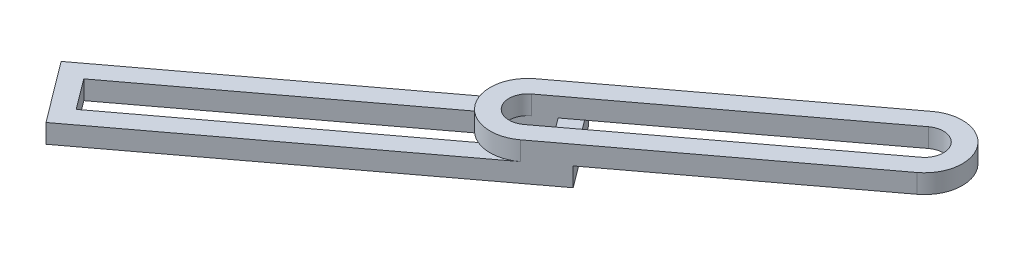
ISO-10303-21;
HEADER;
FILE_DESCRIPTION(('STEP AP214'),'2;1');
FILE_NAME('part.step','',(''),(''),'','','');
FILE_SCHEMA(('AUTOMOTIVE_DESIGN { 1 0 10303 214 1 1 1 1 }'));
ENDSEC;
DATA;
#1=APPLICATION_CONTEXT('core data for automotive mechanical design processes');
#2=APPLICATION_PROTOCOL_DEFINITION('international standard','automotive_design',2000,#1);
#3=PRODUCT_CONTEXT('',#1,'mechanical');
#4=PRODUCT('Part','Part','',(#3));
#5=PRODUCT_RELATED_PRODUCT_CATEGORY('part','',(#4));
#6=PRODUCT_DEFINITION_FORMATION('','',#4);
#7=PRODUCT_DEFINITION_CONTEXT('part definition',#1,'design');
#8=PRODUCT_DEFINITION('design','',#6,#7);
#9=PRODUCT_DEFINITION_SHAPE('','',#8);
#10=(LENGTH_UNIT() NAMED_UNIT(*) SI_UNIT(.MILLI.,.METRE.));
#11=(NAMED_UNIT(*) PLANE_ANGLE_UNIT() SI_UNIT($,.RADIAN.));
#12=(NAMED_UNIT(*) SI_UNIT($,.STERADIAN.) SOLID_ANGLE_UNIT());
#13=UNCERTAINTY_MEASURE_WITH_UNIT(LENGTH_MEASURE(1.E-05),#10,'distance_accuracy_value','');
#14=(GEOMETRIC_REPRESENTATION_CONTEXT(3) GLOBAL_UNCERTAINTY_ASSIGNED_CONTEXT((#13)) GLOBAL_UNIT_ASSIGNED_CONTEXT((#10,
#11,#12)) REPRESENTATION_CONTEXT('',''));
#15=CARTESIAN_POINT('',(0.,0.,0.));
#16=DIRECTION('',(0.,0.,1.));
#17=DIRECTION('',(1.,0.,0.));
#18=AXIS2_PLACEMENT_3D('',#15,#16,#17);
#19=CARTESIAN_POINT('',(0.,-2.,0.));
#20=DIRECTION('',(0.,1.,0.));
#21=DIRECTION('',(0.,0.,1.));
#22=AXIS2_PLACEMENT_3D('',#19,#20,#21);
#23=PLANE('',#22);
#24=DIRECTION('',(-0.8,0.,0.6));
#25=VECTOR('',#24,1.);
#26=CARTESIAN_POINT('',(21.1244876172001,-2.,28.1659834896001));
#27=LINE('',#26,#25);
#28=CARTESIAN_POINT('',(72.9212085995397,-2.,-10.6815572471546));
#29=VERTEX_POINT('',#28);
#30=CARTESIAN_POINT('',(71.3212085995398,-2.,-9.48155724715466));
#31=VERTEX_POINT('',#30);
#32=EDGE_CURVE('E11',#29,#31,#27,.T.);
#33=ORIENTED_EDGE('',*,*,#32,.F.);
#34=DIRECTION('',(0.6,0.,0.8));
#35=VECTOR('',#34,1.);
#36=CARTESIAN_POINT('',(51.7967209823397,-2.,-38.8475407367547));
#37=LINE('',#36,#35);
#38=CARTESIAN_POINT('',(70.5212085995397,-2.,-13.8815572471547));
#39=VERTEX_POINT('',#38);
#40=EDGE_CURVE('E245',#39,#29,#37,.T.);
#41=ORIENTED_EDGE('',*,*,#40,.F.);
#42=DIRECTION('',(-0.8,0.,0.6));
#43=VECTOR('',#42,1.);
#44=CARTESIAN_POINT('',(18.7244876172001,-2.,24.9659834896001));
#45=LINE('',#44,#43);
#46=CARTESIAN_POINT('',(68.9212085995398,-2.,-12.6815572471547));
#47=VERTEX_POINT('',#46);
#48=EDGE_CURVE('E44',#39,#47,#45,.T.);
#49=ORIENTED_EDGE('',*,*,#48,.T.);
#50=DIRECTION('',(0.6,0.,0.8));
#51=VECTOR('',#50,1.);
#52=CARTESIAN_POINT('',(50.1967209823397,-2.,-37.6475407367548));
#53=LINE('',#52,#51);
#54=EDGE_CURVE('E251',#47,#31,#53,.T.);
#55=ORIENTED_EDGE('',*,*,#54,.T.);
#56=EDGE_LOOP('',(#33,#41,#49,#55));
#57=FACE_BOUND('',#56,.T.);
#58=ADVANCED_FACE('F35',(#57),#23,.T.);
#59=CARTESIAN_POINT('',(50.1967209823397,-2.,-37.6475407367548));
#60=DIRECTION('',(0.8,0.,-0.6));
#61=DIRECTION('',(-0.6,0.,-0.8));
#62=AXIS2_PLACEMENT_3D('',#59,#60,#61);
#63=PLANE('',#62);
#64=DIRECTION('',(0.6,0.,0.8));
#65=VECTOR('',#64,1.);
#66=CARTESIAN_POINT('',(50.1967209823397,-4.,-37.6475407367548));
#67=LINE('',#66,#65);
#68=CARTESIAN_POINT('',(68.9212085995398,-4.,-12.6815572471547));
#69=VERTEX_POINT('',#68);
#70=CARTESIAN_POINT('',(71.3212085995398,-4.,-9.48155724715466));
#71=VERTEX_POINT('',#70);
#72=EDGE_CURVE('E271',#69,#71,#67,.T.);
#73=ORIENTED_EDGE('',*,*,#72,.T.);
#74=DIRECTION('',(0.,-1.,0.));
#75=VECTOR('',#74,1.);
#76=CARTESIAN_POINT('',(71.3212085995398,-2.,-9.48155724715466));
#77=LINE('',#76,#75);
#78=EDGE_CURVE('E288',#31,#71,#77,.T.);
#79=ORIENTED_EDGE('',*,*,#78,.F.);
#80=ORIENTED_EDGE('',*,*,#54,.F.);
#81=DIRECTION('',(0.,-1.,0.));
#82=VECTOR('',#81,1.);
#83=CARTESIAN_POINT('',(68.9212085995398,-2.,-12.6815572471547));
#84=LINE('',#83,#82);
#85=EDGE_CURVE('E282',#47,#69,#84,.T.);
#86=ORIENTED_EDGE('',*,*,#85,.T.);
#87=EDGE_LOOP('',(#73,#79,#80,#86));
#88=FACE_BOUND('',#87,.T.);
#89=ADVANCED_FACE('F331',(#88),#63,.F.);
#90=CARTESIAN_POINT('',(21.1244876172001,-2.,28.1659834896001));
#91=DIRECTION('',(-0.6,0.,-0.8));
#92=DIRECTION('',(-0.8,0.,0.6));
#93=AXIS2_PLACEMENT_3D('',#90,#91,#92);
#94=PLANE('',#93);
#95=DIRECTION('',(0.8,0.,-0.6));
#96=VECTOR('',#95,1.);
#97=CARTESIAN_POINT('',(21.1244876172001,-4.,28.1659834896001));
#98=LINE('',#97,#96);
#99=CARTESIAN_POINT('',(42.6212085995398,-4.,12.0434427528453));
#100=VERTEX_POINT('',#99);
#101=EDGE_CURVE('E274',#100,#71,#98,.T.);
#102=ORIENTED_EDGE('',*,*,#101,.F.);
#103=DIRECTION('',(0.,-1.,0.));
#104=VECTOR('',#103,1.);
#105=CARTESIAN_POINT('',(42.6212085995398,-2.,12.0434427528453));
#106=LINE('',#105,#104);
#107=CARTESIAN_POINT('',(42.6212085995398,-2.,12.0434427528453));
#108=VERTEX_POINT('',#107);
#109=EDGE_CURVE('E286',#108,#100,#106,.T.);
#110=ORIENTED_EDGE('',*,*,#109,.F.);
#111=DIRECTION('',(0.8,0.,-0.6));
#112=VECTOR('',#111,1.);
#113=CARTESIAN_POINT('',(21.1244876172001,-2.,28.1659834896001));
#114=LINE('',#113,#112);
#115=CARTESIAN_POINT('',(66.9499273074295,-2.,-6.203096278072));
#116=VERTEX_POINT('',#115);
#117=EDGE_CURVE('E253',#108,#116,#114,.T.);
#118=ORIENTED_EDGE('',*,*,#117,.T.);
#119=CARTESIAN_POINT('',(69.7212085995398,-2.,-8.28155724715468));
#120=VERTEX_POINT('',#119);
#121=EDGE_CURVE('E61',#116,#120,#114,.T.);
#122=ORIENTED_EDGE('',*,*,#121,.T.);
#123=DIRECTION('',(0.,-1.,0.));
#124=VECTOR('',#123,1.);
#125=CARTESIAN_POINT('',(69.7212085995398,0.,-8.28155724715468));
#126=LINE('',#125,#124);
#127=CARTESIAN_POINT('',(69.7212085995398,0.,-8.28155724715468));
#128=VERTEX_POINT('',#127);
#129=EDGE_CURVE('E168',#128,#120,#126,.T.);
#130=ORIENTED_EDGE('',*,*,#129,.F.);
#131=DIRECTION('',(-0.8,0.,0.6));
#132=VECTOR('',#131,1.);
#133=CARTESIAN_POINT('',(21.1244876172001,0.,28.1659834896001));
#134=LINE('',#133,#132);
#135=CARTESIAN_POINT('',(93.7212085995398,0.,-26.2815572471546));
#136=VERTEX_POINT('',#135);
#137=EDGE_CURVE('E175',#136,#128,#134,.T.);
#138=ORIENTED_EDGE('',*,*,#137,.F.);
#139=DIRECTION('',(0.,-1.,0.));
#140=VECTOR('',#139,1.);
#141=CARTESIAN_POINT('',(93.7212085995398,0.,-26.2815572471546));
#142=LINE('',#141,#140);
#143=CARTESIAN_POINT('',(93.7212085995398,-2.,-26.2815572471546));
#144=VERTEX_POINT('',#143);
#145=EDGE_CURVE('E198',#136,#144,#142,.T.);
#146=ORIENTED_EDGE('',*,*,#145,.T.);
#147=EDGE_CURVE('E46',#144,#29,#27,.T.);
#148=ORIENTED_EDGE('',*,*,#147,.T.);
#149=ORIENTED_EDGE('',*,*,#32,.T.);
#150=ORIENTED_EDGE('',*,*,#78,.T.);
#151=EDGE_LOOP('',(#102,#110,#118,#122,#130,#138,#146,#148,#149,#150));
#152=FACE_BOUND('',#151,.T.);
#153=ADVANCED_FACE('F179',(#152),#94,.T.);
#154=CARTESIAN_POINT('',(21.4967209823397,-2.,-16.1225407367548));
#155=DIRECTION('',(0.8,0.,-0.6));
#156=DIRECTION('',(-0.6,0.,-0.8));
#157=AXIS2_PLACEMENT_3D('',#154,#155,#156);
#158=PLANE('',#157);
#159=DIRECTION('',(0.6,0.,0.8));
#160=VECTOR('',#159,1.);
#161=CARTESIAN_POINT('',(21.4967209823397,-4.,-16.1225407367548));
#162=LINE('',#161,#160);
#163=CARTESIAN_POINT('',(40.2212085995398,-4.,8.84344275284533));
#164=VERTEX_POINT('',#163);
#165=EDGE_CURVE('E277',#164,#100,#162,.T.);
#166=ORIENTED_EDGE('',*,*,#165,.F.);
#167=DIRECTION('',(0.,-1.,0.));
#168=VECTOR('',#167,1.);
#169=CARTESIAN_POINT('',(40.2212085995398,-2.,8.84344275284533));
#170=LINE('',#169,#168);
#171=CARTESIAN_POINT('',(40.2212085995398,-2.,8.84344275284533));
#172=VERTEX_POINT('',#171);
#173=EDGE_CURVE('E284',#172,#164,#170,.T.);
#174=ORIENTED_EDGE('',*,*,#173,.F.);
#175=DIRECTION('',(0.6,0.,0.8));
#176=VECTOR('',#175,1.);
#177=CARTESIAN_POINT('',(21.4967209823397,-2.,-16.1225407367548));
#178=LINE('',#177,#176);
#179=EDGE_CURVE('E255',#172,#108,#178,.T.);
#180=ORIENTED_EDGE('',*,*,#179,.T.);
#181=ORIENTED_EDGE('',*,*,#109,.T.);
#182=EDGE_LOOP('',(#166,#174,#180,#181));
#183=FACE_BOUND('',#182,.T.);
#184=ADVANCED_FACE('F353',(#183),#158,.T.);
#185=CARTESIAN_POINT('',(22.3244876172001,-2.,29.7659834896001));
#186=DIRECTION('',(0.6,0.,0.8));
#187=DIRECTION('',(0.8,0.,-0.6));
#188=AXIS2_PLACEMENT_3D('',#185,#186,#187);
#189=PLANE('',#188);
#190=DIRECTION('',(-0.8,0.,0.6));
#191=VECTOR('',#190,1.);
#192=CARTESIAN_POINT('',(22.3244876172001,-4.,29.7659834896001));
#193=LINE('',#192,#191);
#194=CARTESIAN_POINT('',(74.1212085995397,-4.,-9.08155724715465));
#195=VERTEX_POINT('',#194);
#196=CARTESIAN_POINT('',(42.2212085995398,-4.,14.8434427528453));
#197=VERTEX_POINT('',#196);
#198=EDGE_CURVE('E236',#195,#197,#193,.T.);
#199=ORIENTED_EDGE('',*,*,#198,.F.);
#200=DIRECTION('',(0.,-1.,0.));
#201=VECTOR('',#200,1.);
#202=CARTESIAN_POINT('',(74.1212085995397,-2.,-9.08155724715465));
#203=LINE('',#202,#201);
#204=CARTESIAN_POINT('',(74.1212085995397,-2.,-9.08155724715465));
#205=VERTEX_POINT('',#204);
#206=EDGE_CURVE('E39',#205,#195,#203,.T.);
#207=ORIENTED_EDGE('',*,*,#206,.F.);
#208=DIRECTION('',(0.8,0.,-0.599999999999999));
#209=VECTOR('',#208,1.);
#210=CARTESIAN_POINT('',(22.3244876172,-2.,29.7659834896001));
#211=LINE('',#210,#209);
#212=CARTESIAN_POINT('',(94.9212085995398,-2.,-24.6815572471546));
#213=VERTEX_POINT('',#212);
#214=EDGE_CURVE('E200',#205,#213,#211,.T.);
#215=ORIENTED_EDGE('',*,*,#214,.T.);
#216=DIRECTION('',(0.,-1.,0.));
#217=VECTOR('',#216,1.);
#218=CARTESIAN_POINT('',(94.9212085995398,0.,-24.6815572471546));
#219=LINE('',#218,#217);
#220=CARTESIAN_POINT('',(94.9212085995398,0.,-24.6815572471546));
#221=VERTEX_POINT('',#220);
#222=EDGE_CURVE('E233',#221,#213,#219,.T.);
#223=ORIENTED_EDGE('',*,*,#222,.F.);
#224=DIRECTION('',(0.8,0.,-0.599999999999999));
#225=VECTOR('',#224,1.);
#226=CARTESIAN_POINT('',(22.3244876172,0.,29.7659834896001));
#227=LINE('',#226,#225);
#228=CARTESIAN_POINT('',(70.9212085995398,0.,-6.68155724715465));
#229=VERTEX_POINT('',#228);
#230=EDGE_CURVE('E204',#229,#221,#227,.T.);
#231=ORIENTED_EDGE('',*,*,#230,.F.);
#232=DIRECTION('',(0.,-1.,0.));
#233=VECTOR('',#232,1.);
#234=CARTESIAN_POINT('',(70.9212085995398,0.,-6.68155724715465));
#235=LINE('',#234,#233);
#236=CARTESIAN_POINT('',(70.9212085995398,-2.,-6.68155724715465));
#237=VERTEX_POINT('',#236);
#238=EDGE_CURVE('E214',#229,#237,#235,.T.);
#239=ORIENTED_EDGE('',*,*,#238,.T.);
#240=DIRECTION('',(-0.8,0.,0.6));
#241=VECTOR('',#240,1.);
#242=CARTESIAN_POINT('',(22.3244876172001,-2.,29.7659834896001));
#243=LINE('',#242,#241);
#244=CARTESIAN_POINT('',(42.2212085995398,-2.,14.8434427528453));
#245=VERTEX_POINT('',#244);
#246=EDGE_CURVE('E237',#237,#245,#243,.T.);
#247=ORIENTED_EDGE('',*,*,#246,.T.);
#248=DIRECTION('',(0.,-1.,0.));
#249=VECTOR('',#248,1.);
#250=CARTESIAN_POINT('',(42.2212085995398,-2.,14.8434427528453));
#251=LINE('',#250,#249);
#252=EDGE_CURVE('E290',#245,#197,#251,.T.);
#253=ORIENTED_EDGE('',*,*,#252,.T.);
#254=EDGE_LOOP('',(#199,#207,#215,#223,#231,#239,#247,#253));
#255=FACE_BOUND('',#254,.T.);
#256=ADVANCED_FACE('F37',(#255),#189,.T.);
#257=CARTESIAN_POINT('',(51.7967209823397,-2.,-38.8475407367547));
#258=DIRECTION('',(0.8,0.,-0.6));
#259=DIRECTION('',(-0.6,0.,-0.8));
#260=AXIS2_PLACEMENT_3D('',#257,#258,#259);
#261=PLANE('',#260);
#262=DIRECTION('',(0.6,0.,0.8));
#263=VECTOR('',#262,1.);
#264=CARTESIAN_POINT('',(51.7967209823397,-4.,-38.8475407367547));
#265=LINE('',#264,#263);
#266=CARTESIAN_POINT('',(69.3212085995397,-4.,-15.4815572471547));
#267=VERTEX_POINT('',#266);
#268=EDGE_CURVE('E262',#267,#195,#265,.T.);
#269=ORIENTED_EDGE('',*,*,#268,.F.);
#270=DIRECTION('',(0.,-1.,0.));
#271=VECTOR('',#270,1.);
#272=CARTESIAN_POINT('',(69.3212085995397,-2.,-15.4815572471547));
#273=LINE('',#272,#271);
#274=CARTESIAN_POINT('',(69.3212085995397,-2.,-15.4815572471547));
#275=VERTEX_POINT('',#274);
#276=EDGE_CURVE('E293',#275,#267,#273,.T.);
#277=ORIENTED_EDGE('',*,*,#276,.F.);
#278=EDGE_CURVE('E241',#275,#39,#37,.T.);
#279=ORIENTED_EDGE('',*,*,#278,.T.);
#280=ORIENTED_EDGE('',*,*,#40,.T.);
#281=EDGE_CURVE('E239',#29,#205,#37,.T.);
#282=ORIENTED_EDGE('',*,*,#281,.T.);
#283=ORIENTED_EDGE('',*,*,#206,.T.);
#284=EDGE_LOOP('',(#269,#277,#279,#280,#282,#283));
#285=FACE_BOUND('',#284,.T.);
#286=ADVANCED_FACE('F300',(#285),#261,.T.);
#287=CARTESIAN_POINT('',(17.5244876172001,-2.,23.3659834896001));
#288=DIRECTION('',(-0.600000000000001,0.,-0.8));
#289=DIRECTION('',(-0.8,0.,0.600000000000001));
#290=AXIS2_PLACEMENT_3D('',#287,#288,#289);
#291=PLANE('',#290);
#292=DIRECTION('',(0.8,0.,-0.600000000000001));
#293=VECTOR('',#292,1.);
#294=CARTESIAN_POINT('',(17.5244876172001,-4.,23.3659834896001));
#295=LINE('',#294,#293);
#296=CARTESIAN_POINT('',(37.4212085995398,-4.,8.44344275284533));
#297=VERTEX_POINT('',#296);
#298=EDGE_CURVE('E265',#297,#267,#295,.T.);
#299=ORIENTED_EDGE('',*,*,#298,.F.);
#300=DIRECTION('',(0.,-1.,0.));
#301=VECTOR('',#300,1.);
#302=CARTESIAN_POINT('',(37.4212085995398,-2.,8.44344275284533));
#303=LINE('',#302,#301);
#304=CARTESIAN_POINT('',(37.4212085995398,-2.,8.44344275284533));
#305=VERTEX_POINT('',#304);
#306=EDGE_CURVE('E292',#305,#297,#303,.T.);
#307=ORIENTED_EDGE('',*,*,#306,.F.);
#308=DIRECTION('',(0.8,0.,-0.600000000000001));
#309=VECTOR('',#308,1.);
#310=CARTESIAN_POINT('',(17.5244876172001,-2.,23.3659834896001));
#311=LINE('',#310,#309);
#312=CARTESIAN_POINT('',(66.1212085995397,-2.,-13.0815572471547));
#313=VERTEX_POINT('',#312);
#314=EDGE_CURVE('E244',#305,#313,#311,.T.);
#315=ORIENTED_EDGE('',*,*,#314,.T.);
#316=DIRECTION('',(0.,-1.,0.));
#317=VECTOR('',#316,1.);
#318=CARTESIAN_POINT('',(66.1212085995398,0.,-13.0815572471547));
#319=LINE('',#318,#317);
#320=CARTESIAN_POINT('',(66.1212085995398,0.,-13.0815572471547));
#321=VERTEX_POINT('',#320);
#322=EDGE_CURVE('E227',#321,#313,#319,.T.);
#323=ORIENTED_EDGE('',*,*,#322,.F.);
#324=DIRECTION('',(-0.800000000000001,0.,0.599999999999999));
#325=VECTOR('',#324,1.);
#326=CARTESIAN_POINT('',(17.5244876172,0.,23.3659834896001));
#327=LINE('',#326,#325);
#328=CARTESIAN_POINT('',(90.1212085995398,0.,-31.0815572471546));
#329=VERTEX_POINT('',#328);
#330=EDGE_CURVE('E210',#329,#321,#327,.T.);
#331=ORIENTED_EDGE('',*,*,#330,.F.);
#332=DIRECTION('',(0.,-1.,0.));
#333=VECTOR('',#332,1.);
#334=CARTESIAN_POINT('',(90.1212085995398,0.,-31.0815572471546));
#335=LINE('',#334,#333);
#336=CARTESIAN_POINT('',(90.1212085995398,-2.,-31.0815572471546));
#337=VERTEX_POINT('',#336);
#338=EDGE_CURVE('E230',#329,#337,#335,.T.);
#339=ORIENTED_EDGE('',*,*,#338,.T.);
#340=DIRECTION('',(-0.800000000000001,0.,0.599999999999999));
#341=VECTOR('',#340,1.);
#342=CARTESIAN_POINT('',(17.5244876172,-2.,23.3659834896001));
#343=LINE('',#342,#341);
#344=EDGE_CURVE('E218',#337,#275,#343,.T.);
#345=ORIENTED_EDGE('',*,*,#344,.T.);
#346=ORIENTED_EDGE('',*,*,#276,.T.);
#347=EDGE_LOOP('',(#299,#307,#315,#323,#331,#339,#345,#346));
#348=FACE_BOUND('',#347,.T.);
#349=ADVANCED_FACE('F310',(#348),#291,.T.);
#350=CARTESIAN_POINT('',(19.8967209823397,-2.,-14.9225407367548));
#351=DIRECTION('',(-0.8,0.,0.6));
#352=DIRECTION('',(0.6,0.,0.8));
#353=AXIS2_PLACEMENT_3D('',#350,#351,#352);
#354=PLANE('',#353);
#355=DIRECTION('',(-0.6,0.,-0.8));
#356=VECTOR('',#355,1.);
#357=CARTESIAN_POINT('',(19.8967209823397,-4.,-14.9225407367548));
#358=LINE('',#357,#356);
#359=EDGE_CURVE('E268',#197,#297,#358,.T.);
#360=ORIENTED_EDGE('',*,*,#359,.F.);
#361=ORIENTED_EDGE('',*,*,#252,.F.);
#362=DIRECTION('',(-0.6,0.,-0.8));
#363=VECTOR('',#362,1.);
#364=CARTESIAN_POINT('',(19.8967209823397,-2.,-14.9225407367548));
#365=LINE('',#364,#363);
#366=EDGE_CURVE('E248',#245,#305,#365,.T.);
#367=ORIENTED_EDGE('',*,*,#366,.T.);
#368=ORIENTED_EDGE('',*,*,#306,.T.);
#369=EDGE_LOOP('',(#360,#361,#367,#368));
#370=FACE_BOUND('',#369,.T.);
#371=ADVANCED_FACE('F318',(#370),#354,.T.);
#372=CARTESIAN_POINT('',(18.7244876172002,-2.,24.9659834896001));
#373=DIRECTION('',(0.600000000000002,0.,0.799999999999999));
#374=DIRECTION('',(0.799999999999999,0.,-0.600000000000002));
#375=AXIS2_PLACEMENT_3D('',#372,#373,#374);
#376=PLANE('',#375);
#377=DIRECTION('',(-0.799999999999999,0.,0.600000000000002));
#378=VECTOR('',#377,1.);
#379=CARTESIAN_POINT('',(18.7244876172002,-4.,24.9659834896001));
#380=LINE('',#379,#378);
#381=EDGE_CURVE('E240',#69,#164,#380,.T.);
#382=ORIENTED_EDGE('',*,*,#381,.F.);
#383=ORIENTED_EDGE('',*,*,#85,.F.);
#384=ORIENTED_EDGE('',*,*,#48,.F.);
#385=CARTESIAN_POINT('',(91.3212085995398,-2.,-29.4815572471547));
#386=VERTEX_POINT('',#385);
#387=EDGE_CURVE('E188',#386,#39,#45,.T.);
#388=ORIENTED_EDGE('',*,*,#387,.F.);
#389=DIRECTION('',(0.,-1.,0.));
#390=VECTOR('',#389,1.);
#391=CARTESIAN_POINT('',(91.3212085995398,0.,-29.4815572471547));
#392=LINE('',#391,#390);
#393=CARTESIAN_POINT('',(91.3212085995398,0.,-29.4815572471547));
#394=VERTEX_POINT('',#393);
#395=EDGE_CURVE('E201',#394,#386,#392,.T.);
#396=ORIENTED_EDGE('',*,*,#395,.F.);
#397=DIRECTION('',(-0.8,0.,0.6));
#398=VECTOR('',#397,1.);
#399=CARTESIAN_POINT('',(18.7244876172001,0.,24.9659834896001));
#400=LINE('',#399,#398);
#401=CARTESIAN_POINT('',(67.3212085995398,0.,-11.4815572471547));
#402=VERTEX_POINT('',#401);
#403=EDGE_CURVE('E174',#394,#402,#400,.T.);
#404=ORIENTED_EDGE('',*,*,#403,.T.);
#405=DIRECTION('',(0.,-1.,0.));
#406=VECTOR('',#405,1.);
#407=CARTESIAN_POINT('',(67.3212085995398,0.,-11.4815572471547));
#408=LINE('',#407,#406);
#409=CARTESIAN_POINT('',(67.3212085995397,-2.,-11.4815572471547));
#410=VERTEX_POINT('',#409);
#411=EDGE_CURVE('E169',#402,#410,#408,.T.);
#412=ORIENTED_EDGE('',*,*,#411,.T.);
#413=DIRECTION('',(-0.799999999999999,0.,0.600000000000002));
#414=VECTOR('',#413,1.);
#415=CARTESIAN_POINT('',(18.7244876172002,-2.,24.9659834896001));
#416=LINE('',#415,#414);
#417=CARTESIAN_POINT('',(64.5499273074295,-2.,-9.40309627807208));
#418=VERTEX_POINT('',#417);
#419=EDGE_CURVE('E53',#410,#418,#416,.T.);
#420=ORIENTED_EDGE('',*,*,#419,.T.);
#421=EDGE_CURVE('E258',#418,#172,#416,.T.);
#422=ORIENTED_EDGE('',*,*,#421,.T.);
#423=ORIENTED_EDGE('',*,*,#173,.T.);
#424=EDGE_LOOP('',(#382,#383,#384,#388,#396,#404,#412,#420,#422,#423));
#425=FACE_BOUND('',#424,.T.);
#426=ADVANCED_FACE('F320',(#425),#376,.T.);
#427=CARTESIAN_POINT('',(68.5212085995397,-2.,-9.88155724715465));
#428=DIRECTION('',(0.,1.,0.));
#429=DIRECTION('',(0.,0.,1.));
#430=AXIS2_PLACEMENT_3D('',#427,#428,#429);
#431=CIRCLE('',#430,4.);
#432=EDGE_CURVE('E208',#313,#418,#431,.T.);
#433=ORIENTED_EDGE('',*,*,#432,.F.);
#434=ORIENTED_EDGE('',*,*,#314,.F.);
#435=ORIENTED_EDGE('',*,*,#366,.F.);
#436=ORIENTED_EDGE('',*,*,#246,.F.);
#437=EDGE_CURVE('E224',#116,#237,#431,.T.);
#438=ORIENTED_EDGE('',*,*,#437,.F.);
#439=ORIENTED_EDGE('',*,*,#117,.F.);
#440=ORIENTED_EDGE('',*,*,#179,.F.);
#441=ORIENTED_EDGE('',*,*,#421,.F.);
#442=EDGE_LOOP('',(#433,#434,#435,#436,#438,#439,#440,#441));
#443=FACE_BOUND('',#442,.T.);
#444=ADVANCED_FACE('F316',(#443),#23,.T.);
#445=CARTESIAN_POINT('',(0.,-4.,0.));
#446=DIRECTION('',(0.,1.,0.));
#447=DIRECTION('',(0.,0.,1.));
#448=AXIS2_PLACEMENT_3D('',#445,#446,#447);
#449=PLANE('',#448);
#450=ORIENTED_EDGE('',*,*,#198,.T.);
#451=ORIENTED_EDGE('',*,*,#359,.T.);
#452=ORIENTED_EDGE('',*,*,#298,.T.);
#453=ORIENTED_EDGE('',*,*,#268,.T.);
#454=EDGE_LOOP('',(#450,#451,#452,#453));
#455=FACE_BOUND('',#454,.T.);
#456=ORIENTED_EDGE('',*,*,#72,.F.);
#457=ORIENTED_EDGE('',*,*,#381,.T.);
#458=ORIENTED_EDGE('',*,*,#165,.T.);
#459=ORIENTED_EDGE('',*,*,#101,.T.);
#460=EDGE_LOOP('',(#456,#457,#458,#459));
#461=FACE_BOUND('',#460,.T.);
#462=ADVANCED_FACE('F308',(#455,#461),#449,.F.);
#463=CARTESIAN_POINT('',(92.5212085995397,-2.,-27.8815572471546));
#464=DIRECTION('',(0.,1.,0.));
#465=DIRECTION('',(0.,0.,1.));
#466=AXIS2_PLACEMENT_3D('',#463,#464,#465);
#467=PLANE('',#466);
#468=ORIENTED_EDGE('',*,*,#278,.F.);
#469=ORIENTED_EDGE('',*,*,#344,.F.);
#470=CARTESIAN_POINT('',(92.5212085995397,-2.,-27.8815572471546));
#471=DIRECTION('',(0.,1.,0.));
#472=DIRECTION('',(0.,0.,1.));
#473=AXIS2_PLACEMENT_3D('',#470,#471,#472);
#474=CIRCLE('',#473,4.);
#475=EDGE_CURVE('E216',#213,#337,#474,.T.);
#476=ORIENTED_EDGE('',*,*,#475,.F.);
#477=ORIENTED_EDGE('',*,*,#214,.F.);
#478=ORIENTED_EDGE('',*,*,#281,.F.);
#479=ORIENTED_EDGE('',*,*,#147,.F.);
#480=CARTESIAN_POINT('',(92.5212085995397,-2.,-27.8815572471546));
#481=DIRECTION('',(0.,1.,0.));
#482=DIRECTION('',(0.,0.,1.));
#483=AXIS2_PLACEMENT_3D('',#480,#481,#482);
#484=CIRCLE('',#483,2.);
#485=EDGE_CURVE('E185',#144,#386,#484,.T.);
#486=ORIENTED_EDGE('',*,*,#485,.T.);
#487=ORIENTED_EDGE('',*,*,#387,.T.);
#488=EDGE_LOOP('',(#468,#469,#476,#477,#478,#479,#486,#487));
#489=FACE_BOUND('',#488,.T.);
#490=ADVANCED_FACE('F344',(#489),#467,.F.);
#491=CARTESIAN_POINT('',(92.5212085995397,0.,-27.8815572471546));
#492=DIRECTION('',(0.,-1.,0.));
#493=DIRECTION('',(0.,0.,-1.));
#494=AXIS2_PLACEMENT_3D('',#491,#492,#493);
#495=CYLINDRICAL_SURFACE('',#494,4.);
#496=ORIENTED_EDGE('',*,*,#475,.T.);
#497=ORIENTED_EDGE('',*,*,#338,.F.);
#498=CARTESIAN_POINT('',(92.5212085995397,0.,-27.8815572471546));
#499=DIRECTION('',(0.,1.,0.));
#500=DIRECTION('',(0.,0.,1.));
#501=AXIS2_PLACEMENT_3D('',#498,#499,#500);
#502=CIRCLE('',#501,4.);
#503=EDGE_CURVE('E207',#221,#329,#502,.T.);
#504=ORIENTED_EDGE('',*,*,#503,.F.);
#505=ORIENTED_EDGE('',*,*,#222,.T.);
#506=EDGE_LOOP('',(#496,#497,#504,#505));
#507=FACE_BOUND('',#506,.T.);
#508=ADVANCED_FACE('F348',(#507),#495,.T.);
#509=CARTESIAN_POINT('',(68.5212085995397,0.,-9.88155724715465));
#510=DIRECTION('',(0.,-1.,0.));
#511=DIRECTION('',(0.,0.,-1.));
#512=AXIS2_PLACEMENT_3D('',#509,#510,#511);
#513=CYLINDRICAL_SURFACE('',#512,4.);
#514=ORIENTED_EDGE('',*,*,#432,.T.);
#515=EDGE_CURVE('E221',#418,#116,#431,.T.);
#516=ORIENTED_EDGE('',*,*,#515,.T.);
#517=ORIENTED_EDGE('',*,*,#437,.T.);
#518=ORIENTED_EDGE('',*,*,#238,.F.);
#519=CARTESIAN_POINT('',(68.5212085995397,0.,-9.88155724715465));
#520=DIRECTION('',(0.,1.,0.));
#521=DIRECTION('',(0.,0.,1.));
#522=AXIS2_PLACEMENT_3D('',#519,#520,#521);
#523=CIRCLE('',#522,4.);
#524=EDGE_CURVE('E212',#321,#229,#523,.T.);
#525=ORIENTED_EDGE('',*,*,#524,.F.);
#526=ORIENTED_EDGE('',*,*,#322,.T.);
#527=EDGE_LOOP('',(#514,#516,#517,#518,#525,#526));
#528=FACE_BOUND('',#527,.T.);
#529=ADVANCED_FACE('F511',(#528),#513,.T.);
#530=CARTESIAN_POINT('',(92.5212085995397,0.,-27.8815572471546));
#531=DIRECTION('',(0.,1.,0.));
#532=DIRECTION('',(0.,0.,1.));
#533=AXIS2_PLACEMENT_3D('',#530,#531,#532);
#534=PLANE('',#533);
#535=ORIENTED_EDGE('',*,*,#137,.T.);
#536=CARTESIAN_POINT('',(68.5212085995397,0.,-9.88155724715465));
#537=DIRECTION('',(0.,1.,0.));
#538=DIRECTION('',(0.,0.,1.));
#539=AXIS2_PLACEMENT_3D('',#536,#537,#538);
#540=CIRCLE('',#539,2.);
#541=EDGE_CURVE('E165',#402,#128,#540,.T.);
#542=ORIENTED_EDGE('',*,*,#541,.F.);
#543=ORIENTED_EDGE('',*,*,#403,.F.);
#544=CARTESIAN_POINT('',(92.5212085995397,0.,-27.8815572471546));
#545=DIRECTION('',(0.,1.,0.));
#546=DIRECTION('',(0.,0.,1.));
#547=AXIS2_PLACEMENT_3D('',#544,#545,#546);
#548=CIRCLE('',#547,2.);
#549=EDGE_CURVE('E181',#136,#394,#548,.T.);
#550=ORIENTED_EDGE('',*,*,#549,.F.);
#551=EDGE_LOOP('',(#535,#542,#543,#550));
#552=FACE_BOUND('',#551,.T.);
#553=ORIENTED_EDGE('',*,*,#230,.T.);
#554=ORIENTED_EDGE('',*,*,#503,.T.);
#555=ORIENTED_EDGE('',*,*,#330,.T.);
#556=ORIENTED_EDGE('',*,*,#524,.T.);
#557=EDGE_LOOP('',(#553,#554,#555,#556));
#558=FACE_BOUND('',#557,.T.);
#559=ADVANCED_FACE('F183',(#552,#558),#534,.T.);
#560=ORIENTED_EDGE('',*,*,#121,.F.);
#561=ORIENTED_EDGE('',*,*,#515,.F.);
#562=ORIENTED_EDGE('',*,*,#419,.F.);
#563=CARTESIAN_POINT('',(68.5212085995397,-2.,-9.88155724715465));
#564=DIRECTION('',(0.,1.,0.));
#565=DIRECTION('',(0.,0.,1.));
#566=AXIS2_PLACEMENT_3D('',#563,#564,#565);
#567=CIRCLE('',#566,2.);
#568=EDGE_CURVE('E194',#410,#120,#567,.T.);
#569=ORIENTED_EDGE('',*,*,#568,.T.);
#570=EDGE_LOOP('',(#560,#561,#562,#569));
#571=FACE_BOUND('',#570,.T.);
#572=ADVANCED_FACE('F351',(#571),#467,.F.);
#573=CARTESIAN_POINT('',(92.5212085995397,0.,-27.8815572471546));
#574=DIRECTION('',(0.,-1.,0.));
#575=DIRECTION('',(0.,0.,-1.));
#576=AXIS2_PLACEMENT_3D('',#573,#574,#575);
#577=CYLINDRICAL_SURFACE('',#576,2.);
#578=ORIENTED_EDGE('',*,*,#485,.F.);
#579=ORIENTED_EDGE('',*,*,#145,.F.);
#580=ORIENTED_EDGE('',*,*,#549,.T.);
#581=ORIENTED_EDGE('',*,*,#395,.T.);
#582=EDGE_LOOP('',(#578,#579,#580,#581));
#583=FACE_BOUND('',#582,.T.);
#584=ADVANCED_FACE('F558',(#583),#577,.F.);
#585=CARTESIAN_POINT('',(68.5212085995397,0.,-9.88155724715465));
#586=DIRECTION('',(0.,-1.,0.));
#587=DIRECTION('',(0.,0.,-1.));
#588=AXIS2_PLACEMENT_3D('',#585,#586,#587);
#589=CYLINDRICAL_SURFACE('',#588,2.);
#590=ORIENTED_EDGE('',*,*,#568,.F.);
#591=ORIENTED_EDGE('',*,*,#411,.F.);
#592=ORIENTED_EDGE('',*,*,#541,.T.);
#593=ORIENTED_EDGE('',*,*,#129,.T.);
#594=EDGE_LOOP('',(#590,#591,#592,#593));
#595=FACE_BOUND('',#594,.T.);
#596=ADVANCED_FACE('F167',(#595),#589,.F.);
#597=CLOSED_SHELL('',(#58,#89,#153,#184,#256,#286,#349,#371,#426,#444,#462,#490,#508,#529,#559,
#572,#584,#596));
#598=MANIFOLD_SOLID_BREP('B2',#597);
#599=ADVANCED_BREP_SHAPE_REPRESENTATION('',(#18,#598),#14);
#600=SHAPE_DEFINITION_REPRESENTATION(#9,#599);
ENDSEC;
END-ISO-10303-21;
